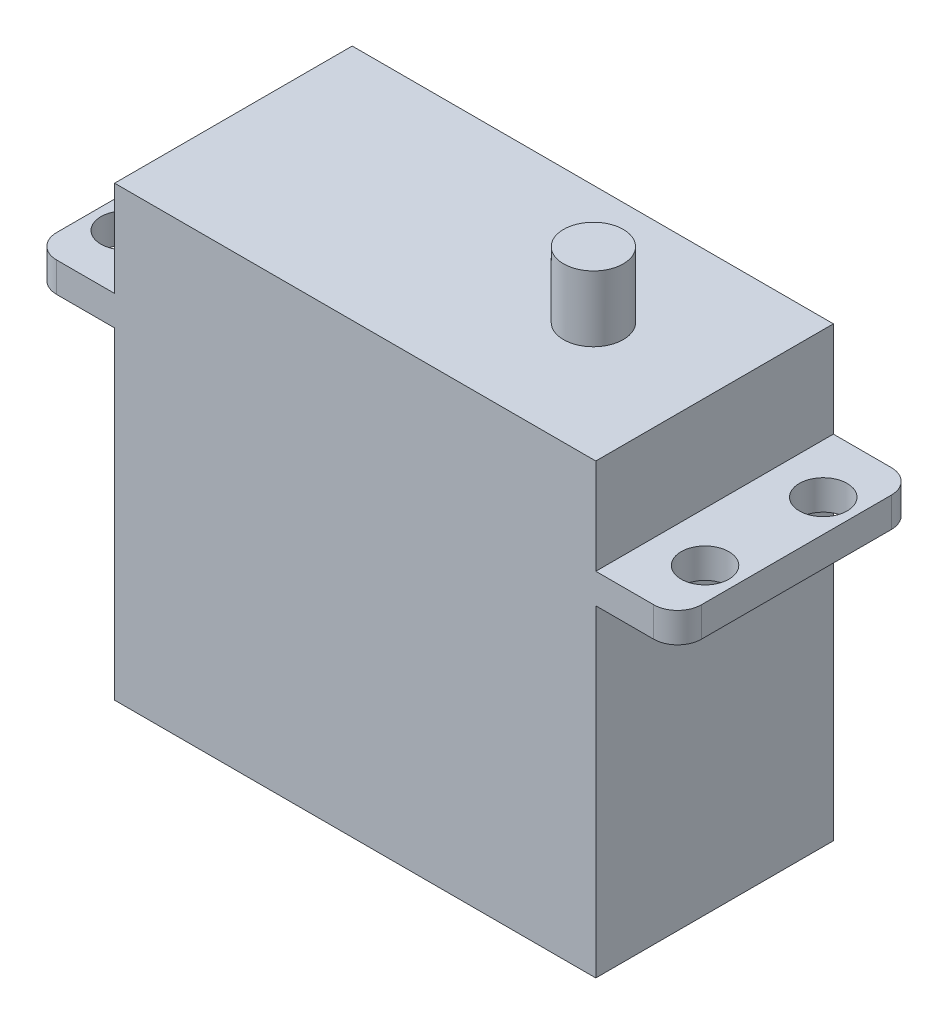
ISO-10303-21;
HEADER;
FILE_DESCRIPTION(('STEP AP214'),'2;1');
FILE_NAME('part.step','',(''),(''),'','','');
FILE_SCHEMA(('AUTOMOTIVE_DESIGN { 1 0 10303 214 1 1 1 1 }'));
ENDSEC;
DATA;
#1=APPLICATION_CONTEXT('core data for automotive mechanical design processes');
#2=APPLICATION_PROTOCOL_DEFINITION('international standard','automotive_design',2000,#1);
#3=PRODUCT_CONTEXT('',#1,'mechanical');
#4=PRODUCT('Part','Part','',(#3));
#5=PRODUCT_RELATED_PRODUCT_CATEGORY('part','',(#4));
#6=PRODUCT_DEFINITION_FORMATION('','',#4);
#7=PRODUCT_DEFINITION_CONTEXT('part definition',#1,'design');
#8=PRODUCT_DEFINITION('design','',#6,#7);
#9=PRODUCT_DEFINITION_SHAPE('','',#8);
#10=(LENGTH_UNIT() NAMED_UNIT(*) SI_UNIT(.MILLI.,.METRE.));
#11=(NAMED_UNIT(*) PLANE_ANGLE_UNIT() SI_UNIT($,.RADIAN.));
#12=(NAMED_UNIT(*) SI_UNIT($,.STERADIAN.) SOLID_ANGLE_UNIT());
#13=UNCERTAINTY_MEASURE_WITH_UNIT(LENGTH_MEASURE(1.E-05),#10,'distance_accuracy_value','');
#14=(GEOMETRIC_REPRESENTATION_CONTEXT(3) GLOBAL_UNCERTAINTY_ASSIGNED_CONTEXT((#13)) GLOBAL_UNIT_ASSIGNED_CONTEXT((#10,
#11,#12)) REPRESENTATION_CONTEXT('',''));
#15=CARTESIAN_POINT('',(0.,0.,0.));
#16=DIRECTION('',(0.,0.,1.));
#17=DIRECTION('',(1.,0.,0.));
#18=AXIS2_PLACEMENT_3D('',#15,#16,#17);
#19=CARTESIAN_POINT('',(20.15,37.5,9.95));
#20=DIRECTION('',(-1.,0.,0.));
#21=DIRECTION('',(0.,0.,1.));
#22=AXIS2_PLACEMENT_3D('',#19,#20,#21);
#23=PLANE('',#22);
#24=DIRECTION('',(0.,0.,1.));
#25=VECTOR('',#24,1.);
#26=CARTESIAN_POINT('',(20.15,29.5,9.95));
#27=LINE('',#26,#25);
#28=CARTESIAN_POINT('',(20.15,29.5,-9.95));
#29=VERTEX_POINT('',#28);
#30=CARTESIAN_POINT('',(20.15,29.5,9.95));
#31=VERTEX_POINT('',#30);
#32=EDGE_CURVE('E186',#29,#31,#27,.T.);
#33=ORIENTED_EDGE('',*,*,#32,.F.);
#34=DIRECTION('',(0.,-1.,0.));
#35=VECTOR('',#34,1.);
#36=CARTESIAN_POINT('',(20.15,37.5,-9.95));
#37=LINE('',#36,#35);
#38=CARTESIAN_POINT('',(20.15,37.5,-9.95));
#39=VERTEX_POINT('',#38);
#40=EDGE_CURVE('E214',#39,#29,#37,.T.);
#41=ORIENTED_EDGE('',*,*,#40,.F.);
#42=DIRECTION('',(0.,0.,-1.));
#43=VECTOR('',#42,1.);
#44=CARTESIAN_POINT('',(20.15,37.5,9.95));
#45=LINE('',#44,#43);
#46=CARTESIAN_POINT('',(20.15,37.5,9.95));
#47=VERTEX_POINT('',#46);
#48=EDGE_CURVE('E190',#47,#39,#45,.T.);
#49=ORIENTED_EDGE('',*,*,#48,.F.);
#50=DIRECTION('',(0.,-1.,0.));
#51=VECTOR('',#50,1.);
#52=CARTESIAN_POINT('',(20.15,37.5,9.95));
#53=LINE('',#52,#51);
#54=EDGE_CURVE('E158',#47,#31,#53,.T.);
#55=ORIENTED_EDGE('',*,*,#54,.T.);
#56=EDGE_LOOP('',(#33,#41,#49,#55));
#57=FACE_BOUND('',#56,.T.);
#58=ADVANCED_FACE('F34',(#57),#23,.F.);
#59=CARTESIAN_POINT('',(-20.15,37.5,9.95));
#60=DIRECTION('',(1.,0.,0.));
#61=DIRECTION('',(0.,0.,-1.));
#62=AXIS2_PLACEMENT_3D('',#59,#60,#61);
#63=PLANE('',#62);
#64=DIRECTION('',(0.,0.,-1.));
#65=VECTOR('',#64,1.);
#66=CARTESIAN_POINT('',(-20.15,29.5,9.95));
#67=LINE('',#66,#65);
#68=CARTESIAN_POINT('',(-20.15,29.5,9.95));
#69=VERTEX_POINT('',#68);
#70=CARTESIAN_POINT('',(-20.15,29.5,-9.95));
#71=VERTEX_POINT('',#70);
#72=EDGE_CURVE('E168',#69,#71,#67,.T.);
#73=ORIENTED_EDGE('',*,*,#72,.F.);
#74=DIRECTION('',(0.,-1.,0.));
#75=VECTOR('',#74,1.);
#76=CARTESIAN_POINT('',(-20.15,37.5,9.95));
#77=LINE('',#76,#75);
#78=CARTESIAN_POINT('',(-20.15,37.5,9.95));
#79=VERTEX_POINT('',#78);
#80=EDGE_CURVE('E207',#79,#69,#77,.T.);
#81=ORIENTED_EDGE('',*,*,#80,.F.);
#82=DIRECTION('',(0.,0.,1.));
#83=VECTOR('',#82,1.);
#84=CARTESIAN_POINT('',(-20.15,37.5,9.95));
#85=LINE('',#84,#83);
#86=CARTESIAN_POINT('',(-20.15,37.5,-9.95));
#87=VERTEX_POINT('',#86);
#88=EDGE_CURVE('E195',#87,#79,#85,.T.);
#89=ORIENTED_EDGE('',*,*,#88,.F.);
#90=DIRECTION('',(0.,-1.,0.));
#91=VECTOR('',#90,1.);
#92=CARTESIAN_POINT('',(-20.15,37.5,-9.95));
#93=LINE('',#92,#91);
#94=EDGE_CURVE('E211',#87,#71,#93,.T.);
#95=ORIENTED_EDGE('',*,*,#94,.T.);
#96=EDGE_LOOP('',(#73,#81,#89,#95));
#97=FACE_BOUND('',#96,.T.);
#98=ADVANCED_FACE('F338',(#97),#63,.F.);
#99=CARTESIAN_POINT('',(20.15,27.,-9.95));
#100=VERTEX_POINT('',#99);
#101=CARTESIAN_POINT('',(20.15,0.,-9.95));
#102=VERTEX_POINT('',#101);
#103=EDGE_CURVE('E165',#100,#102,#37,.T.);
#104=ORIENTED_EDGE('',*,*,#103,.F.);
#105=DIRECTION('',(0.,0.,1.));
#106=VECTOR('',#105,1.);
#107=CARTESIAN_POINT('',(20.15,27.,9.95));
#108=LINE('',#107,#106);
#109=CARTESIAN_POINT('',(20.15,27.,9.95));
#110=VERTEX_POINT('',#109);
#111=EDGE_CURVE('E163',#100,#110,#108,.T.);
#112=ORIENTED_EDGE('',*,*,#111,.T.);
#113=CARTESIAN_POINT('',(20.15,0.,9.95));
#114=VERTEX_POINT('',#113);
#115=EDGE_CURVE('E147',#110,#114,#53,.T.);
#116=ORIENTED_EDGE('',*,*,#115,.T.);
#117=DIRECTION('',(0.,0.,-1.));
#118=VECTOR('',#117,1.);
#119=CARTESIAN_POINT('',(20.15,0.,9.95));
#120=LINE('',#119,#118);
#121=EDGE_CURVE('E189',#114,#102,#120,.T.);
#122=ORIENTED_EDGE('',*,*,#121,.T.);
#123=EDGE_LOOP('',(#104,#112,#116,#122));
#124=FACE_BOUND('',#123,.T.);
#125=ADVANCED_FACE('F164',(#124),#23,.F.);
#126=CARTESIAN_POINT('',(-20.15,37.5,-9.95));
#127=DIRECTION('',(0.,0.,1.));
#128=DIRECTION('',(1.,0.,0.));
#129=AXIS2_PLACEMENT_3D('',#126,#127,#128);
#130=PLANE('',#129);
#131=DIRECTION('',(-1.,0.,0.));
#132=VECTOR('',#131,1.);
#133=CARTESIAN_POINT('',(-27.,29.5,-9.95));
#134=LINE('',#133,#132);
#135=CARTESIAN_POINT('',(25.,29.5,-9.95000000000001));
#136=VERTEX_POINT('',#135);
#137=EDGE_CURVE('E283',#136,#29,#134,.T.);
#138=ORIENTED_EDGE('',*,*,#137,.F.);
#139=DIRECTION('',(0.,-1.,0.));
#140=VECTOR('',#139,1.);
#141=CARTESIAN_POINT('',(25.,37.5,-9.95));
#142=LINE('',#141,#140);
#143=CARTESIAN_POINT('',(25.,27.,-9.95000000000001));
#144=VERTEX_POINT('',#143);
#145=EDGE_CURVE('E222',#136,#144,#142,.T.);
#146=ORIENTED_EDGE('',*,*,#145,.T.);
#147=DIRECTION('',(-1.,0.,0.));
#148=VECTOR('',#147,1.);
#149=CARTESIAN_POINT('',(-27.,27.,-9.95));
#150=LINE('',#149,#148);
#151=EDGE_CURVE('E178',#144,#100,#150,.T.);
#152=ORIENTED_EDGE('',*,*,#151,.T.);
#153=ORIENTED_EDGE('',*,*,#103,.T.);
#154=DIRECTION('',(-1.,0.,0.));
#155=VECTOR('',#154,1.);
#156=CARTESIAN_POINT('',(-20.15,0.,-9.95));
#157=LINE('',#156,#155);
#158=CARTESIAN_POINT('',(-20.15,0.,-9.95));
#159=VERTEX_POINT('',#158);
#160=EDGE_CURVE('E199',#102,#159,#157,.T.);
#161=ORIENTED_EDGE('',*,*,#160,.T.);
#162=CARTESIAN_POINT('',(-20.15,27.,-9.95));
#163=VERTEX_POINT('',#162);
#164=EDGE_CURVE('E210',#163,#159,#93,.T.);
#165=ORIENTED_EDGE('',*,*,#164,.F.);
#166=CARTESIAN_POINT('',(-25.,27.,-9.95));
#167=VERTEX_POINT('',#166);
#168=EDGE_CURVE('E271',#163,#167,#150,.T.);
#169=ORIENTED_EDGE('',*,*,#168,.T.);
#170=DIRECTION('',(0.,-1.,0.));
#171=VECTOR('',#170,1.);
#172=CARTESIAN_POINT('',(-25.,37.5,-9.95));
#173=LINE('',#172,#171);
#174=CARTESIAN_POINT('',(-25.,29.5,-9.95));
#175=VERTEX_POINT('',#174);
#176=EDGE_CURVE('E220',#167,#175,#173,.F.);
#177=ORIENTED_EDGE('',*,*,#176,.T.);
#178=EDGE_CURVE('E285',#71,#175,#134,.T.);
#179=ORIENTED_EDGE('',*,*,#178,.F.);
#180=ORIENTED_EDGE('',*,*,#94,.F.);
#181=DIRECTION('',(-1.,0.,0.));
#182=VECTOR('',#181,1.);
#183=CARTESIAN_POINT('',(-20.15,37.5,-9.95));
#184=LINE('',#183,#182);
#185=EDGE_CURVE('E193',#39,#87,#184,.T.);
#186=ORIENTED_EDGE('',*,*,#185,.F.);
#187=ORIENTED_EDGE('',*,*,#40,.T.);
#188=EDGE_LOOP('',(#138,#146,#152,#153,#161,#165,#169,#177,#179,#180,#186,#187));
#189=FACE_BOUND('',#188,.T.);
#190=ADVANCED_FACE('F275',(#189),#130,.F.);
#191=CARTESIAN_POINT('',(-20.15,27.,9.95));
#192=VERTEX_POINT('',#191);
#193=CARTESIAN_POINT('',(-20.15,0.,9.95));
#194=VERTEX_POINT('',#193);
#195=EDGE_CURVE('E206',#192,#194,#77,.T.);
#196=ORIENTED_EDGE('',*,*,#195,.F.);
#197=DIRECTION('',(0.,0.,-1.));
#198=VECTOR('',#197,1.);
#199=CARTESIAN_POINT('',(-20.15,27.,9.95));
#200=LINE('',#199,#198);
#201=EDGE_CURVE('E169',#192,#163,#200,.T.);
#202=ORIENTED_EDGE('',*,*,#201,.T.);
#203=ORIENTED_EDGE('',*,*,#164,.T.);
#204=DIRECTION('',(0.,0.,1.));
#205=VECTOR('',#204,1.);
#206=CARTESIAN_POINT('',(-20.15,0.,9.95));
#207=LINE('',#206,#205);
#208=EDGE_CURVE('E202',#159,#194,#207,.T.);
#209=ORIENTED_EDGE('',*,*,#208,.T.);
#210=EDGE_LOOP('',(#196,#202,#203,#209));
#211=FACE_BOUND('',#210,.T.);
#212=ADVANCED_FACE('F367',(#211),#63,.F.);
#213=CARTESIAN_POINT('',(-20.15,37.5,9.95));
#214=DIRECTION('',(0.,0.,-1.));
#215=DIRECTION('',(-1.,0.,0.));
#216=AXIS2_PLACEMENT_3D('',#213,#214,#215);
#217=PLANE('',#216);
#218=DIRECTION('',(1.,0.,0.));
#219=VECTOR('',#218,1.);
#220=CARTESIAN_POINT('',(-27.,27.,9.95));
#221=LINE('',#220,#219);
#222=CARTESIAN_POINT('',(25.,27.,9.95000000000001));
#223=VERTEX_POINT('',#222);
#224=EDGE_CURVE('E151',#110,#223,#221,.T.);
#225=ORIENTED_EDGE('',*,*,#224,.T.);
#226=DIRECTION('',(0.,-1.,0.));
#227=VECTOR('',#226,1.);
#228=CARTESIAN_POINT('',(25.,37.5,9.95));
#229=LINE('',#228,#227);
#230=CARTESIAN_POINT('',(25.,29.5,9.95000000000001));
#231=VERTEX_POINT('',#230);
#232=EDGE_CURVE('E240',#223,#231,#229,.F.);
#233=ORIENTED_EDGE('',*,*,#232,.T.);
#234=DIRECTION('',(1.,0.,0.));
#235=VECTOR('',#234,1.);
#236=CARTESIAN_POINT('',(-27.,29.5,9.95));
#237=LINE('',#236,#235);
#238=EDGE_CURVE('E259',#31,#231,#237,.T.);
#239=ORIENTED_EDGE('',*,*,#238,.F.);
#240=ORIENTED_EDGE('',*,*,#54,.F.);
#241=DIRECTION('',(1.,0.,0.));
#242=VECTOR('',#241,1.);
#243=CARTESIAN_POINT('',(-20.15,37.5,9.95));
#244=LINE('',#243,#242);
#245=EDGE_CURVE('E159',#79,#47,#244,.T.);
#246=ORIENTED_EDGE('',*,*,#245,.F.);
#247=ORIENTED_EDGE('',*,*,#80,.T.);
#248=CARTESIAN_POINT('',(-25.,29.5,9.95));
#249=VERTEX_POINT('',#248);
#250=EDGE_CURVE('E183',#249,#69,#237,.T.);
#251=ORIENTED_EDGE('',*,*,#250,.F.);
#252=DIRECTION('',(0.,-1.,0.));
#253=VECTOR('',#252,1.);
#254=CARTESIAN_POINT('',(-25.,37.5,9.95));
#255=LINE('',#254,#253);
#256=CARTESIAN_POINT('',(-25.,27.,9.95));
#257=VERTEX_POINT('',#256);
#258=EDGE_CURVE('E237',#249,#257,#255,.T.);
#259=ORIENTED_EDGE('',*,*,#258,.T.);
#260=EDGE_CURVE('E174',#257,#192,#221,.T.);
#261=ORIENTED_EDGE('',*,*,#260,.T.);
#262=ORIENTED_EDGE('',*,*,#195,.T.);
#263=DIRECTION('',(1.,0.,0.));
#264=VECTOR('',#263,1.);
#265=CARTESIAN_POINT('',(-20.15,0.,9.95));
#266=LINE('',#265,#264);
#267=EDGE_CURVE('E154',#194,#114,#266,.T.);
#268=ORIENTED_EDGE('',*,*,#267,.T.);
#269=ORIENTED_EDGE('',*,*,#115,.F.);
#270=EDGE_LOOP('',(#225,#233,#239,#240,#246,#247,#251,#259,#261,#262,#268,#269));
#271=FACE_BOUND('',#270,.T.);
#272=ADVANCED_FACE('F149',(#271),#217,.F.);
#273=CARTESIAN_POINT('',(0.,37.5,0.));
#274=DIRECTION('',(0.,-1.,0.));
#275=DIRECTION('',(0.,0.,-1.));
#276=AXIS2_PLACEMENT_3D('',#273,#274,#275);
#277=PLANE('',#276);
#278=CARTESIAN_POINT('',(9.99999999999999,37.5,0.));
#279=DIRECTION('',(0.,-1.,0.));
#280=DIRECTION('',(0.,0.,-1.));
#281=AXIS2_PLACEMENT_3D('',#278,#279,#280);
#282=CIRCLE('',#281,2.5);
#283=CARTESIAN_POINT('',(9.99999999999999,37.5,-2.5));
#284=VERTEX_POINT('',#283);
#285=EDGE_CURVE('E217',#284,#284,#282,.F.);
#286=ORIENTED_EDGE('',*,*,#285,.F.);
#287=EDGE_LOOP('',(#286));
#288=FACE_BOUND('',#287,.T.);
#289=ORIENTED_EDGE('',*,*,#48,.T.);
#290=ORIENTED_EDGE('',*,*,#185,.T.);
#291=ORIENTED_EDGE('',*,*,#88,.T.);
#292=ORIENTED_EDGE('',*,*,#245,.T.);
#293=EDGE_LOOP('',(#289,#290,#291,#292));
#294=FACE_BOUND('',#293,.T.);
#295=ADVANCED_FACE('F324',(#288,#294),#277,.F.);
#296=CARTESIAN_POINT('',(0.,0.,0.));
#297=DIRECTION('',(0.,-1.,0.));
#298=DIRECTION('',(0.,0.,-1.));
#299=AXIS2_PLACEMENT_3D('',#296,#297,#298);
#300=PLANE('',#299);
#301=ORIENTED_EDGE('',*,*,#121,.F.);
#302=ORIENTED_EDGE('',*,*,#267,.F.);
#303=ORIENTED_EDGE('',*,*,#208,.F.);
#304=ORIENTED_EDGE('',*,*,#160,.F.);
#305=EDGE_LOOP('',(#301,#302,#303,#304));
#306=FACE_BOUND('',#305,.T.);
#307=ADVANCED_FACE('F327',(#306),#300,.T.);
#308=CARTESIAN_POINT('',(-24.3,29.5,4.95000000000001));
#309=DIRECTION('',(0.,-1.,0.));
#310=DIRECTION('',(0.,0.,-1.));
#311=AXIS2_PLACEMENT_3D('',#308,#309,#310);
#312=CYLINDRICAL_SURFACE('',#311,2.);
#313=CARTESIAN_POINT('',(-24.3,29.5,4.95000000000001));
#314=DIRECTION('',(0.,1.,0.));
#315=DIRECTION('',(0.,0.,1.));
#316=AXIS2_PLACEMENT_3D('',#313,#314,#315);
#317=CIRCLE('',#316,2.);
#318=CARTESIAN_POINT('',(-24.3,29.5,6.95000000000001));
#319=VERTEX_POINT('',#318);
#320=EDGE_CURVE('E297',#319,#319,#317,.T.);
#321=ORIENTED_EDGE('',*,*,#320,.T.);
#322=EDGE_LOOP('',(#321));
#323=FACE_BOUND('',#322,.T.);
#324=CARTESIAN_POINT('',(-24.3,27.,4.95000000000001));
#325=DIRECTION('',(0.,1.,0.));
#326=DIRECTION('',(0.,0.,1.));
#327=AXIS2_PLACEMENT_3D('',#324,#325,#326);
#328=CIRCLE('',#327,2.);
#329=CARTESIAN_POINT('',(-24.3,27.,6.95000000000001));
#330=VERTEX_POINT('',#329);
#331=EDGE_CURVE('E300',#330,#330,#328,.T.);
#332=ORIENTED_EDGE('',*,*,#331,.F.);
#333=EDGE_LOOP('',(#332));
#334=FACE_BOUND('',#333,.T.);
#335=ADVANCED_FACE('F381',(#323,#334),#312,.F.);
#336=CARTESIAN_POINT('',(-24.3,29.5,-4.95));
#337=DIRECTION('',(0.,-1.,0.));
#338=DIRECTION('',(0.,0.,-1.));
#339=AXIS2_PLACEMENT_3D('',#336,#337,#338);
#340=CYLINDRICAL_SURFACE('',#339,2.);
#341=CARTESIAN_POINT('',(-24.3,29.5,-4.95));
#342=DIRECTION('',(0.,1.,0.));
#343=DIRECTION('',(0.,0.,-1.));
#344=AXIS2_PLACEMENT_3D('',#341,#342,#343);
#345=CIRCLE('',#344,2.);
#346=CARTESIAN_POINT('',(-24.3,29.5,-6.95));
#347=VERTEX_POINT('',#346);
#348=EDGE_CURVE('E303',#347,#347,#345,.T.);
#349=ORIENTED_EDGE('',*,*,#348,.T.);
#350=EDGE_LOOP('',(#349));
#351=FACE_BOUND('',#350,.T.);
#352=CARTESIAN_POINT('',(-24.3,27.,-4.95));
#353=DIRECTION('',(0.,1.,0.));
#354=DIRECTION('',(0.,0.,-1.));
#355=AXIS2_PLACEMENT_3D('',#352,#353,#354);
#356=CIRCLE('',#355,2.);
#357=CARTESIAN_POINT('',(-24.3,27.,-6.95));
#358=VERTEX_POINT('',#357);
#359=EDGE_CURVE('E306',#358,#358,#356,.T.);
#360=ORIENTED_EDGE('',*,*,#359,.F.);
#361=EDGE_LOOP('',(#360));
#362=FACE_BOUND('',#361,.T.);
#363=ADVANCED_FACE('F389',(#351,#362),#340,.F.);
#364=CARTESIAN_POINT('',(-27.,29.5,9.95));
#365=DIRECTION('',(1.,0.,0.));
#366=DIRECTION('',(0.,0.,-1.));
#367=AXIS2_PLACEMENT_3D('',#364,#365,#366);
#368=PLANE('',#367);
#369=DIRECTION('',(0.,0.,1.));
#370=VECTOR('',#369,1.);
#371=CARTESIAN_POINT('',(-27.,29.5,9.95));
#372=LINE('',#371,#370);
#373=CARTESIAN_POINT('',(-27.,29.5,-7.94999999999999));
#374=VERTEX_POINT('',#373);
#375=CARTESIAN_POINT('',(-27.,29.5,7.95));
#376=VERTEX_POINT('',#375);
#377=EDGE_CURVE('E253',#374,#376,#372,.T.);
#378=ORIENTED_EDGE('',*,*,#377,.F.);
#379=DIRECTION('',(0.,-1.,0.));
#380=VECTOR('',#379,1.);
#381=CARTESIAN_POINT('',(-27.,29.5,-7.95));
#382=LINE('',#381,#380);
#383=CARTESIAN_POINT('',(-27.,27.,-7.94999999999999));
#384=VERTEX_POINT('',#383);
#385=EDGE_CURVE('E243',#374,#384,#382,.T.);
#386=ORIENTED_EDGE('',*,*,#385,.T.);
#387=DIRECTION('',(0.,0.,1.));
#388=VECTOR('',#387,1.);
#389=CARTESIAN_POINT('',(-27.,27.,9.95));
#390=LINE('',#389,#388);
#391=CARTESIAN_POINT('',(-27.,27.,7.95));
#392=VERTEX_POINT('',#391);
#393=EDGE_CURVE('E175',#384,#392,#390,.T.);
#394=ORIENTED_EDGE('',*,*,#393,.T.);
#395=DIRECTION('',(0.,-1.,0.));
#396=VECTOR('',#395,1.);
#397=CARTESIAN_POINT('',(-27.,29.5,7.95));
#398=LINE('',#397,#396);
#399=EDGE_CURVE('E49',#392,#376,#398,.F.);
#400=ORIENTED_EDGE('',*,*,#399,.T.);
#401=EDGE_LOOP('',(#378,#386,#394,#400));
#402=FACE_BOUND('',#401,.T.);
#403=ADVANCED_FACE('F265',(#402),#368,.F.);
#404=CARTESIAN_POINT('',(0.,27.,0.));
#405=DIRECTION('',(0.,-1.,0.));
#406=DIRECTION('',(0.,0.,-1.));
#407=AXIS2_PLACEMENT_3D('',#404,#405,#406);
#408=PLANE('',#407);
#409=ORIENTED_EDGE('',*,*,#359,.T.);
#410=EDGE_LOOP('',(#409));
#411=FACE_BOUND('',#410,.T.);
#412=ORIENTED_EDGE('',*,*,#331,.T.);
#413=EDGE_LOOP('',(#412));
#414=FACE_BOUND('',#413,.T.);
#415=ORIENTED_EDGE('',*,*,#393,.F.);
#416=CARTESIAN_POINT('',(-25.,27.,-7.95));
#417=DIRECTION('',(0.,-1.,0.));
#418=DIRECTION('',(0.,0.,-1.));
#419=AXIS2_PLACEMENT_3D('',#416,#417,#418);
#420=CIRCLE('',#419,2.);
#421=EDGE_CURVE('E248',#384,#167,#420,.T.);
#422=ORIENTED_EDGE('',*,*,#421,.T.);
#423=ORIENTED_EDGE('',*,*,#168,.F.);
#424=ORIENTED_EDGE('',*,*,#201,.F.);
#425=ORIENTED_EDGE('',*,*,#260,.F.);
#426=CARTESIAN_POINT('',(-25.,27.,7.95));
#427=DIRECTION('',(0.,-1.,0.));
#428=DIRECTION('',(0.,0.,-1.));
#429=AXIS2_PLACEMENT_3D('',#426,#427,#428);
#430=CIRCLE('',#429,2.);
#431=EDGE_CURVE('E246',#257,#392,#430,.T.);
#432=ORIENTED_EDGE('',*,*,#431,.T.);
#433=EDGE_LOOP('',(#415,#422,#423,#424,#425,#432));
#434=FACE_BOUND('',#433,.T.);
#435=ADVANCED_FACE('F263',(#411,#414,#434),#408,.T.);
#436=CARTESIAN_POINT('',(0.,29.5,0.));
#437=DIRECTION('',(0.,-1.,0.));
#438=DIRECTION('',(0.,0.,-1.));
#439=AXIS2_PLACEMENT_3D('',#436,#437,#438);
#440=PLANE('',#439);
#441=ORIENTED_EDGE('',*,*,#348,.F.);
#442=EDGE_LOOP('',(#441));
#443=FACE_BOUND('',#442,.T.);
#444=ORIENTED_EDGE('',*,*,#320,.F.);
#445=EDGE_LOOP('',(#444));
#446=FACE_BOUND('',#445,.T.);
#447=ORIENTED_EDGE('',*,*,#178,.T.);
#448=CARTESIAN_POINT('',(-25.,29.5,-7.95));
#449=DIRECTION('',(0.,-1.,0.));
#450=DIRECTION('',(0.,0.,-1.));
#451=AXIS2_PLACEMENT_3D('',#448,#449,#450);
#452=CIRCLE('',#451,2.);
#453=EDGE_CURVE('E11',#175,#374,#452,.F.);
#454=ORIENTED_EDGE('',*,*,#453,.T.);
#455=ORIENTED_EDGE('',*,*,#377,.T.);
#456=CARTESIAN_POINT('',(-25.,29.5,7.95));
#457=DIRECTION('',(0.,-1.,0.));
#458=DIRECTION('',(0.,0.,-1.));
#459=AXIS2_PLACEMENT_3D('',#456,#457,#458);
#460=CIRCLE('',#459,2.);
#461=EDGE_CURVE('E42',#376,#249,#460,.F.);
#462=ORIENTED_EDGE('',*,*,#461,.T.);
#463=ORIENTED_EDGE('',*,*,#250,.T.);
#464=ORIENTED_EDGE('',*,*,#72,.T.);
#465=EDGE_LOOP('',(#447,#454,#455,#462,#463,#464));
#466=FACE_BOUND('',#465,.T.);
#467=ADVANCED_FACE('F251',(#443,#446,#466),#440,.F.);
#468=CARTESIAN_POINT('',(24.3,29.5,4.95));
#469=DIRECTION('',(0.,1.,0.));
#470=DIRECTION('',(0.,0.,-1.));
#471=AXIS2_PLACEMENT_3D('',#468,#469,#470);
#472=CIRCLE('',#471,2.);
#473=CARTESIAN_POINT('',(24.3,29.5,2.95));
#474=VERTEX_POINT('',#473);
#475=EDGE_CURVE('E279',#474,#474,#472,.T.);
#476=ORIENTED_EDGE('',*,*,#475,.F.);
#477=EDGE_LOOP('',(#476));
#478=FACE_BOUND('',#477,.T.);
#479=CARTESIAN_POINT('',(24.3,29.5,-4.95));
#480=DIRECTION('',(0.,1.,0.));
#481=DIRECTION('',(0.,0.,1.));
#482=AXIS2_PLACEMENT_3D('',#479,#480,#481);
#483=CIRCLE('',#482,2.);
#484=CARTESIAN_POINT('',(24.3,29.5,-2.95));
#485=VERTEX_POINT('',#484);
#486=EDGE_CURVE('E291',#485,#485,#483,.T.);
#487=ORIENTED_EDGE('',*,*,#486,.F.);
#488=EDGE_LOOP('',(#487));
#489=FACE_BOUND('',#488,.T.);
#490=DIRECTION('',(0.,0.,-1.));
#491=VECTOR('',#490,1.);
#492=CARTESIAN_POINT('',(27.,29.5,9.95000000000001));
#493=LINE('',#492,#491);
#494=CARTESIAN_POINT('',(27.,29.5,7.95));
#495=VERTEX_POINT('',#494);
#496=CARTESIAN_POINT('',(27.,29.5,-7.95));
#497=VERTEX_POINT('',#496);
#498=EDGE_CURVE('E177',#495,#497,#493,.T.);
#499=ORIENTED_EDGE('',*,*,#498,.T.);
#500=CARTESIAN_POINT('',(25.,29.5,-7.95));
#501=DIRECTION('',(0.,-1.,0.));
#502=DIRECTION('',(0.,0.,-1.));
#503=AXIS2_PLACEMENT_3D('',#500,#501,#502);
#504=CIRCLE('',#503,2.);
#505=EDGE_CURVE('E235',#497,#136,#504,.F.);
#506=ORIENTED_EDGE('',*,*,#505,.T.);
#507=ORIENTED_EDGE('',*,*,#137,.T.);
#508=ORIENTED_EDGE('',*,*,#32,.T.);
#509=ORIENTED_EDGE('',*,*,#238,.T.);
#510=CARTESIAN_POINT('',(25.,29.5,7.95));
#511=DIRECTION('',(0.,-1.,0.));
#512=DIRECTION('',(0.,0.,-1.));
#513=AXIS2_PLACEMENT_3D('',#510,#511,#512);
#514=CIRCLE('',#513,2.);
#515=EDGE_CURVE('E233',#231,#495,#514,.F.);
#516=ORIENTED_EDGE('',*,*,#515,.T.);
#517=EDGE_LOOP('',(#499,#506,#507,#508,#509,#516));
#518=FACE_BOUND('',#517,.T.);
#519=ADVANCED_FACE('F342',(#478,#489,#518),#440,.F.);
#520=CARTESIAN_POINT('',(24.3,27.,-4.95));
#521=DIRECTION('',(0.,1.,0.));
#522=DIRECTION('',(0.,0.,1.));
#523=AXIS2_PLACEMENT_3D('',#520,#521,#522);
#524=CIRCLE('',#523,2.);
#525=CARTESIAN_POINT('',(24.3,27.,-2.95));
#526=VERTEX_POINT('',#525);
#527=EDGE_CURVE('E294',#526,#526,#524,.T.);
#528=ORIENTED_EDGE('',*,*,#527,.T.);
#529=EDGE_LOOP('',(#528));
#530=FACE_BOUND('',#529,.T.);
#531=CARTESIAN_POINT('',(24.3,27.,4.95));
#532=DIRECTION('',(0.,1.,0.));
#533=DIRECTION('',(0.,0.,-1.));
#534=AXIS2_PLACEMENT_3D('',#531,#532,#533);
#535=CIRCLE('',#534,2.);
#536=CARTESIAN_POINT('',(24.3,27.,2.95));
#537=VERTEX_POINT('',#536);
#538=EDGE_CURVE('E288',#537,#537,#535,.T.);
#539=ORIENTED_EDGE('',*,*,#538,.T.);
#540=EDGE_LOOP('',(#539));
#541=FACE_BOUND('',#540,.T.);
#542=ORIENTED_EDGE('',*,*,#151,.F.);
#543=CARTESIAN_POINT('',(25.,27.,-7.95));
#544=DIRECTION('',(0.,-1.,0.));
#545=DIRECTION('',(0.,0.,-1.));
#546=AXIS2_PLACEMENT_3D('',#543,#544,#545);
#547=CIRCLE('',#546,2.);
#548=CARTESIAN_POINT('',(27.,27.,-7.95));
#549=VERTEX_POINT('',#548);
#550=EDGE_CURVE('E226',#144,#549,#547,.T.);
#551=ORIENTED_EDGE('',*,*,#550,.T.);
#552=DIRECTION('',(0.,0.,-1.));
#553=VECTOR('',#552,1.);
#554=CARTESIAN_POINT('',(27.,27.,9.95000000000001));
#555=LINE('',#554,#553);
#556=CARTESIAN_POINT('',(27.,27.,7.95));
#557=VERTEX_POINT('',#556);
#558=EDGE_CURVE('E277',#557,#549,#555,.T.);
#559=ORIENTED_EDGE('',*,*,#558,.F.);
#560=CARTESIAN_POINT('',(25.,27.,7.95));
#561=DIRECTION('',(0.,-1.,0.));
#562=DIRECTION('',(0.,0.,-1.));
#563=AXIS2_PLACEMENT_3D('',#560,#561,#562);
#564=CIRCLE('',#563,2.);
#565=EDGE_CURVE('E173',#557,#223,#564,.T.);
#566=ORIENTED_EDGE('',*,*,#565,.T.);
#567=ORIENTED_EDGE('',*,*,#224,.F.);
#568=ORIENTED_EDGE('',*,*,#111,.F.);
#569=EDGE_LOOP('',(#542,#551,#559,#566,#567,#568));
#570=FACE_BOUND('',#569,.T.);
#571=ADVANCED_FACE('F171',(#530,#541,#570),#408,.T.);
#572=CARTESIAN_POINT('',(27.,29.5,9.95000000000001));
#573=DIRECTION('',(-1.,0.,0.));
#574=DIRECTION('',(0.,0.,1.));
#575=AXIS2_PLACEMENT_3D('',#572,#573,#574);
#576=PLANE('',#575);
#577=ORIENTED_EDGE('',*,*,#558,.T.);
#578=DIRECTION('',(0.,-1.,0.));
#579=VECTOR('',#578,1.);
#580=CARTESIAN_POINT('',(27.,29.5,-7.95));
#581=LINE('',#580,#579);
#582=EDGE_CURVE('E231',#549,#497,#581,.F.);
#583=ORIENTED_EDGE('',*,*,#582,.T.);
#584=ORIENTED_EDGE('',*,*,#498,.F.);
#585=DIRECTION('',(0.,-1.,0.));
#586=VECTOR('',#585,1.);
#587=CARTESIAN_POINT('',(27.,29.5,7.95));
#588=LINE('',#587,#586);
#589=EDGE_CURVE('E228',#495,#557,#588,.T.);
#590=ORIENTED_EDGE('',*,*,#589,.T.);
#591=EDGE_LOOP('',(#577,#583,#584,#590));
#592=FACE_BOUND('',#591,.T.);
#593=ADVANCED_FACE('F350',(#592),#576,.F.);
#594=CARTESIAN_POINT('',(24.3,29.5,4.95));
#595=DIRECTION('',(0.,-1.,0.));
#596=DIRECTION('',(0.,0.,-1.));
#597=AXIS2_PLACEMENT_3D('',#594,#595,#596);
#598=CYLINDRICAL_SURFACE('',#597,2.);
#599=ORIENTED_EDGE('',*,*,#475,.T.);
#600=EDGE_LOOP('',(#599));
#601=FACE_BOUND('',#600,.T.);
#602=ORIENTED_EDGE('',*,*,#538,.F.);
#603=EDGE_LOOP('',(#602));
#604=FACE_BOUND('',#603,.T.);
#605=ADVANCED_FACE('F386',(#601,#604),#598,.F.);
#606=CARTESIAN_POINT('',(24.3,29.5,-4.95));
#607=DIRECTION('',(0.,-1.,0.));
#608=DIRECTION('',(0.,0.,-1.));
#609=AXIS2_PLACEMENT_3D('',#606,#607,#608);
#610=CYLINDRICAL_SURFACE('',#609,2.);
#611=ORIENTED_EDGE('',*,*,#486,.T.);
#612=EDGE_LOOP('',(#611));
#613=FACE_BOUND('',#612,.T.);
#614=ORIENTED_EDGE('',*,*,#527,.F.);
#615=EDGE_LOOP('',(#614));
#616=FACE_BOUND('',#615,.T.);
#617=ADVANCED_FACE('F320',(#613,#616),#610,.F.);
#618=CARTESIAN_POINT('',(9.99999999999999,43.,0.));
#619=DIRECTION('',(0.,-1.,0.));
#620=DIRECTION('',(0.,0.,-1.));
#621=AXIS2_PLACEMENT_3D('',#618,#619,#620);
#622=CYLINDRICAL_SURFACE('',#621,2.5);
#623=CARTESIAN_POINT('',(9.99999999999999,43.,0.));
#624=DIRECTION('',(0.,1.,0.));
#625=DIRECTION('',(0.,0.,1.));
#626=AXIS2_PLACEMENT_3D('',#623,#624,#625);
#627=CIRCLE('',#626,2.5);
#628=CARTESIAN_POINT('',(9.99999999999999,43.,2.5));
#629=VERTEX_POINT('',#628);
#630=EDGE_CURVE('E309',#629,#629,#627,.T.);
#631=ORIENTED_EDGE('',*,*,#630,.F.);
#632=EDGE_LOOP('',(#631));
#633=FACE_BOUND('',#632,.T.);
#634=ORIENTED_EDGE('',*,*,#285,.T.);
#635=EDGE_LOOP('',(#634));
#636=FACE_BOUND('',#635,.T.);
#637=ADVANCED_FACE('F317',(#633,#636),#622,.T.);
#638=CARTESIAN_POINT('',(9.99999999999999,43.,0.));
#639=DIRECTION('',(0.,1.,0.));
#640=DIRECTION('',(0.,0.,1.));
#641=AXIS2_PLACEMENT_3D('',#638,#639,#640);
#642=PLANE('',#641);
#643=ORIENTED_EDGE('',*,*,#630,.T.);
#644=EDGE_LOOP('',(#643));
#645=FACE_BOUND('',#644,.T.);
#646=ADVANCED_FACE('F315',(#645),#642,.T.);
#647=CARTESIAN_POINT('',(25.,37.5,-7.95));
#648=DIRECTION('',(0.,-1.,0.));
#649=DIRECTION('',(0.,0.,-1.));
#650=AXIS2_PLACEMENT_3D('',#647,#648,#649);
#651=CYLINDRICAL_SURFACE('',#650,2.);
#652=ORIENTED_EDGE('',*,*,#505,.F.);
#653=ORIENTED_EDGE('',*,*,#582,.F.);
#654=ORIENTED_EDGE('',*,*,#550,.F.);
#655=ORIENTED_EDGE('',*,*,#145,.F.);
#656=EDGE_LOOP('',(#652,#653,#654,#655));
#657=FACE_BOUND('',#656,.T.);
#658=ADVANCED_FACE('F348',(#657),#651,.T.);
#659=CARTESIAN_POINT('',(25.,29.5,7.95));
#660=DIRECTION('',(0.,-1.,0.));
#661=DIRECTION('',(0.,0.,-1.));
#662=AXIS2_PLACEMENT_3D('',#659,#660,#661);
#663=CYLINDRICAL_SURFACE('',#662,2.);
#664=ORIENTED_EDGE('',*,*,#515,.F.);
#665=ORIENTED_EDGE('',*,*,#232,.F.);
#666=ORIENTED_EDGE('',*,*,#565,.F.);
#667=ORIENTED_EDGE('',*,*,#589,.F.);
#668=EDGE_LOOP('',(#664,#665,#666,#667));
#669=FACE_BOUND('',#668,.T.);
#670=ADVANCED_FACE('F353',(#669),#663,.T.);
#671=CARTESIAN_POINT('',(-25.,29.5,-7.95));
#672=DIRECTION('',(0.,-1.,0.));
#673=DIRECTION('',(0.,0.,-1.));
#674=AXIS2_PLACEMENT_3D('',#671,#672,#673);
#675=CYLINDRICAL_SURFACE('',#674,2.);
#676=ORIENTED_EDGE('',*,*,#453,.F.);
#677=ORIENTED_EDGE('',*,*,#176,.F.);
#678=ORIENTED_EDGE('',*,*,#421,.F.);
#679=ORIENTED_EDGE('',*,*,#385,.F.);
#680=EDGE_LOOP('',(#676,#677,#678,#679));
#681=FACE_BOUND('',#680,.T.);
#682=ADVANCED_FACE('F268',(#681),#675,.T.);
#683=CARTESIAN_POINT('',(-25.,37.5,7.95));
#684=DIRECTION('',(0.,-1.,0.));
#685=DIRECTION('',(0.,0.,-1.));
#686=AXIS2_PLACEMENT_3D('',#683,#684,#685);
#687=CYLINDRICAL_SURFACE('',#686,2.);
#688=ORIENTED_EDGE('',*,*,#461,.F.);
#689=ORIENTED_EDGE('',*,*,#399,.F.);
#690=ORIENTED_EDGE('',*,*,#431,.F.);
#691=ORIENTED_EDGE('',*,*,#258,.F.);
#692=EDGE_LOOP('',(#688,#689,#690,#691));
#693=FACE_BOUND('',#692,.T.);
#694=ADVANCED_FACE('F36',(#693),#687,.T.);
#695=CLOSED_SHELL('',(#58,#98,#125,#190,#212,#272,#295,#307,#335,#363,#403,#435,#467,#519,#571,
#593,#605,#617,#637,#646,#658,#670,#682,#694));
#696=MANIFOLD_SOLID_BREP('B2',#695);
#697=ADVANCED_BREP_SHAPE_REPRESENTATION('',(#18,#696),#14);
#698=SHAPE_DEFINITION_REPRESENTATION(#9,#697);
ENDSEC;
END-ISO-10303-21;
